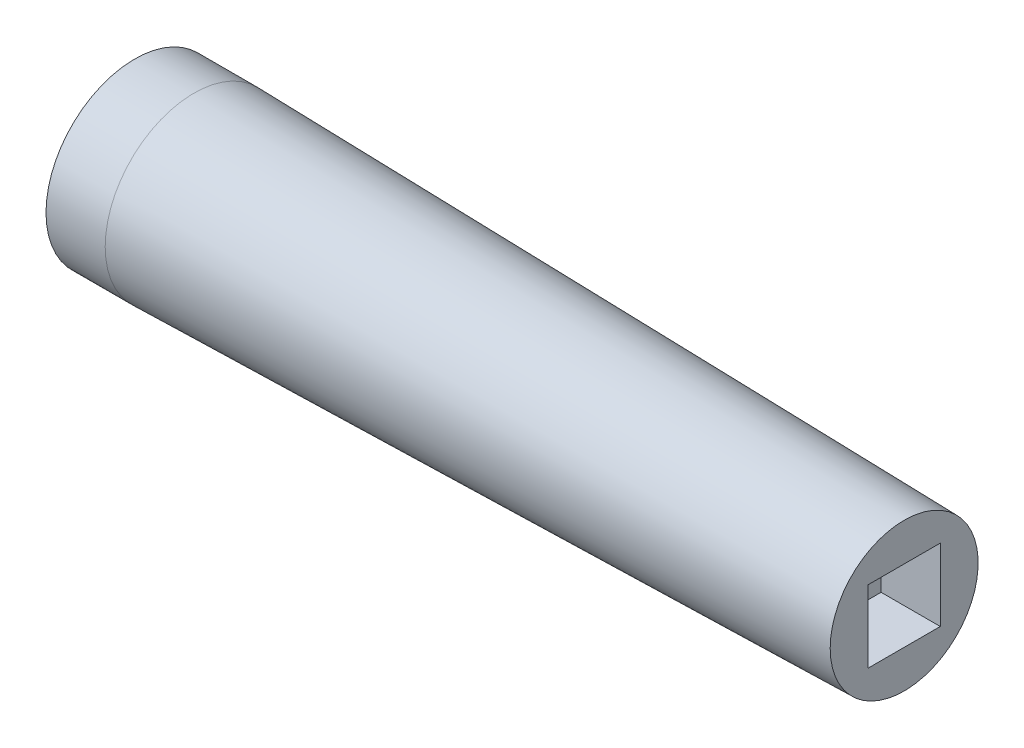
ISO-10303-21;
HEADER;
FILE_DESCRIPTION(('STEP AP214'),'2;1');
FILE_NAME('part.step','',(''),(''),'','','');
FILE_SCHEMA(('AUTOMOTIVE_DESIGN { 1 0 10303 214 1 1 1 1 }'));
ENDSEC;
DATA;
#1=APPLICATION_CONTEXT('core data for automotive mechanical design processes');
#2=APPLICATION_PROTOCOL_DEFINITION('international standard','automotive_design',2000,#1);
#3=PRODUCT_CONTEXT('',#1,'mechanical');
#4=PRODUCT('Part','Part','',(#3));
#5=PRODUCT_RELATED_PRODUCT_CATEGORY('part','',(#4));
#6=PRODUCT_DEFINITION_FORMATION('','',#4);
#7=PRODUCT_DEFINITION_CONTEXT('part definition',#1,'design');
#8=PRODUCT_DEFINITION('design','',#6,#7);
#9=PRODUCT_DEFINITION_SHAPE('','',#8);
#10=(LENGTH_UNIT() NAMED_UNIT(*) SI_UNIT(.MILLI.,.METRE.));
#11=(NAMED_UNIT(*) PLANE_ANGLE_UNIT() SI_UNIT($,.RADIAN.));
#12=(NAMED_UNIT(*) SI_UNIT($,.STERADIAN.) SOLID_ANGLE_UNIT());
#13=UNCERTAINTY_MEASURE_WITH_UNIT(LENGTH_MEASURE(1.E-05),#10,'distance_accuracy_value','');
#14=(GEOMETRIC_REPRESENTATION_CONTEXT(3) GLOBAL_UNCERTAINTY_ASSIGNED_CONTEXT((#13)) GLOBAL_UNIT_ASSIGNED_CONTEXT((#10,
#11,#12)) REPRESENTATION_CONTEXT('',''));
#15=CARTESIAN_POINT('',(0.,0.,0.));
#16=DIRECTION('',(0.,0.,1.));
#17=DIRECTION('',(1.,0.,0.));
#18=AXIS2_PLACEMENT_3D('',#15,#16,#17);
#19=CARTESIAN_POINT('',(0.,19.05,0.));
#20=DIRECTION('',(1.,0.,0.));
#21=DIRECTION('',(0.,0.,-1.));
#22=AXIS2_PLACEMENT_3D('',#19,#20,#21);
#23=PLANE('',#22);
#24=CARTESIAN_POINT('',(0.,0.,0.));
#25=DIRECTION('',(-1.,0.,0.));
#26=DIRECTION('',(0.,0.,1.));
#27=AXIS2_PLACEMENT_3D('',#24,#25,#26);
#28=CIRCLE('',#27,19.05);
#29=CARTESIAN_POINT('',(0.,0.,19.05));
#30=VERTEX_POINT('',#29);
#31=EDGE_CURVE('E108',#30,#30,#28,.T.);
#32=ORIENTED_EDGE('',*,*,#31,.T.);
#33=EDGE_LOOP('',(#32));
#34=FACE_BOUND('',#33,.T.);
#35=ADVANCED_FACE('F33',(#34),#23,.F.);
#36=CARTESIAN_POINT('',(165.1,0.,0.));
#37=DIRECTION('',(-1.,0.,0.));
#38=DIRECTION('',(0.,0.,1.));
#39=AXIS2_PLACEMENT_3D('',#36,#37,#38);
#40=PLANE('',#39);
#41=DIRECTION('',(0.,0.,1.));
#42=VECTOR('',#41,1.);
#43=CARTESIAN_POINT('',(165.1,7.747,7.747));
#44=LINE('',#43,#42);
#45=CARTESIAN_POINT('',(165.1,7.747,-7.747));
#46=VERTEX_POINT('',#45);
#47=CARTESIAN_POINT('',(165.1,7.747,7.747));
#48=VERTEX_POINT('',#47);
#49=EDGE_CURVE('E82',#46,#48,#44,.T.);
#50=ORIENTED_EDGE('',*,*,#49,.F.);
#51=DIRECTION('',(0.,1.,0.));
#52=VECTOR('',#51,1.);
#53=CARTESIAN_POINT('',(165.1,7.747,-7.747));
#54=LINE('',#53,#52);
#55=CARTESIAN_POINT('',(165.1,-7.747,-7.747));
#56=VERTEX_POINT('',#55);
#57=EDGE_CURVE('E47',#56,#46,#54,.T.);
#58=ORIENTED_EDGE('',*,*,#57,.F.);
#59=DIRECTION('',(0.,0.,-1.));
#60=VECTOR('',#59,1.);
#61=CARTESIAN_POINT('',(165.1,-7.747,7.747));
#62=LINE('',#61,#60);
#63=CARTESIAN_POINT('',(165.1,-7.747,7.747));
#64=VERTEX_POINT('',#63);
#65=EDGE_CURVE('E98',#64,#56,#62,.T.);
#66=ORIENTED_EDGE('',*,*,#65,.F.);
#67=DIRECTION('',(0.,-1.,0.));
#68=VECTOR('',#67,1.);
#69=CARTESIAN_POINT('',(165.1,7.747,7.747));
#70=LINE('',#69,#68);
#71=EDGE_CURVE('E104',#48,#64,#70,.T.);
#72=ORIENTED_EDGE('',*,*,#71,.F.);
#73=EDGE_LOOP('',(#50,#58,#66,#72));
#74=FACE_BOUND('',#73,.T.);
#75=CARTESIAN_POINT('',(165.1,0.,0.));
#76=DIRECTION('',(-1.,0.,0.));
#77=DIRECTION('',(0.,0.,1.));
#78=AXIS2_PLACEMENT_3D('',#75,#76,#77);
#79=CIRCLE('',#78,15.875);
#80=CARTESIAN_POINT('',(165.1,0.,15.875));
#81=VERTEX_POINT('',#80);
#82=EDGE_CURVE('E11',#81,#81,#79,.T.);
#83=ORIENTED_EDGE('',*,*,#82,.F.);
#84=EDGE_LOOP('',(#83));
#85=FACE_BOUND('',#84,.T.);
#86=ADVANCED_FACE('F120',(#74,#85),#40,.F.);
#87=CARTESIAN_POINT('',(165.1,0.,0.));
#88=DIRECTION('',(-1.,0.,0.));
#89=DIRECTION('',(0.,0.,1.));
#90=AXIS2_PLACEMENT_3D('',#87,#88,#89);
#91=CONICAL_SURFACE('',#90,15.875,0.0208303200362171);
#92=CARTESIAN_POINT('',(12.7,0.,0.));
#93=DIRECTION('',(-1.,0.,0.));
#94=DIRECTION('',(0.,0.,1.));
#95=AXIS2_PLACEMENT_3D('',#92,#93,#94);
#96=CIRCLE('',#95,19.05);
#97=CARTESIAN_POINT('',(12.7,0.,19.05));
#98=VERTEX_POINT('',#97);
#99=EDGE_CURVE('E40',#98,#98,#96,.T.);
#100=ORIENTED_EDGE('',*,*,#99,.F.);
#101=EDGE_LOOP('',(#100));
#102=FACE_BOUND('',#101,.T.);
#103=ORIENTED_EDGE('',*,*,#82,.T.);
#104=EDGE_LOOP('',(#103));
#105=FACE_BOUND('',#104,.T.);
#106=ADVANCED_FACE('F117',(#102,#105),#91,.T.);
#107=CARTESIAN_POINT('',(0.,0.,0.));
#108=DIRECTION('',(-1.,0.,0.));
#109=DIRECTION('',(0.,0.,1.));
#110=AXIS2_PLACEMENT_3D('',#107,#108,#109);
#111=CYLINDRICAL_SURFACE('',#110,19.05);
#112=ORIENTED_EDGE('',*,*,#31,.F.);
#113=EDGE_LOOP('',(#112));
#114=FACE_BOUND('',#113,.T.);
#115=ORIENTED_EDGE('',*,*,#99,.T.);
#116=EDGE_LOOP('',(#115));
#117=FACE_BOUND('',#116,.T.);
#118=ADVANCED_FACE('F115',(#114,#117),#111,.T.);
#119=CARTESIAN_POINT('',(152.4,7.747,-7.747));
#120=DIRECTION('',(0.,0.,-1.));
#121=DIRECTION('',(0.,1.,0.));
#122=AXIS2_PLACEMENT_3D('',#119,#120,#121);
#123=PLANE('',#122);
#124=ORIENTED_EDGE('',*,*,#57,.T.);
#125=DIRECTION('',(1.,0.,0.));
#126=VECTOR('',#125,1.);
#127=CARTESIAN_POINT('',(152.4,7.747,-7.747));
#128=LINE('',#127,#126);
#129=CARTESIAN_POINT('',(152.4,7.747,-7.747));
#130=VERTEX_POINT('',#129);
#131=EDGE_CURVE('E70',#130,#46,#128,.T.);
#132=ORIENTED_EDGE('',*,*,#131,.F.);
#133=DIRECTION('',(0.,1.,0.));
#134=VECTOR('',#133,1.);
#135=CARTESIAN_POINT('',(152.4,7.747,-7.747));
#136=LINE('',#135,#134);
#137=CARTESIAN_POINT('',(152.4,-7.747,-7.747));
#138=VERTEX_POINT('',#137);
#139=EDGE_CURVE('E96',#138,#130,#136,.T.);
#140=ORIENTED_EDGE('',*,*,#139,.F.);
#141=DIRECTION('',(1.,0.,0.));
#142=VECTOR('',#141,1.);
#143=CARTESIAN_POINT('',(152.4,-7.747,-7.747));
#144=LINE('',#143,#142);
#145=EDGE_CURVE('E55',#138,#56,#144,.T.);
#146=ORIENTED_EDGE('',*,*,#145,.T.);
#147=EDGE_LOOP('',(#124,#132,#140,#146));
#148=FACE_BOUND('',#147,.T.);
#149=ADVANCED_FACE('F133',(#148),#123,.F.);
#150=CARTESIAN_POINT('',(152.4,-7.747,7.747));
#151=DIRECTION('',(0.,-1.,0.));
#152=DIRECTION('',(0.,0.,-1.));
#153=AXIS2_PLACEMENT_3D('',#150,#151,#152);
#154=PLANE('',#153);
#155=ORIENTED_EDGE('',*,*,#65,.T.);
#156=ORIENTED_EDGE('',*,*,#145,.F.);
#157=DIRECTION('',(0.,0.,-1.));
#158=VECTOR('',#157,1.);
#159=CARTESIAN_POINT('',(152.4,-7.747,7.747));
#160=LINE('',#159,#158);
#161=CARTESIAN_POINT('',(152.4,-7.747,7.747));
#162=VERTEX_POINT('',#161);
#163=EDGE_CURVE('E93',#162,#138,#160,.T.);
#164=ORIENTED_EDGE('',*,*,#163,.F.);
#165=DIRECTION('',(1.,0.,0.));
#166=VECTOR('',#165,1.);
#167=CARTESIAN_POINT('',(152.4,-7.747,7.747));
#168=LINE('',#167,#166);
#169=EDGE_CURVE('E86',#162,#64,#168,.T.);
#170=ORIENTED_EDGE('',*,*,#169,.T.);
#171=EDGE_LOOP('',(#155,#156,#164,#170));
#172=FACE_BOUND('',#171,.T.);
#173=ADVANCED_FACE('F137',(#172),#154,.F.);
#174=CARTESIAN_POINT('',(152.4,7.747,7.747));
#175=DIRECTION('',(0.,0.,1.));
#176=DIRECTION('',(0.,-1.,0.));
#177=AXIS2_PLACEMENT_3D('',#174,#175,#176);
#178=PLANE('',#177);
#179=ORIENTED_EDGE('',*,*,#71,.T.);
#180=ORIENTED_EDGE('',*,*,#169,.F.);
#181=DIRECTION('',(0.,-1.,0.));
#182=VECTOR('',#181,1.);
#183=CARTESIAN_POINT('',(152.4,7.747,7.747));
#184=LINE('',#183,#182);
#185=CARTESIAN_POINT('',(152.4,7.747,7.747));
#186=VERTEX_POINT('',#185);
#187=EDGE_CURVE('E89',#186,#162,#184,.T.);
#188=ORIENTED_EDGE('',*,*,#187,.F.);
#189=DIRECTION('',(1.,0.,0.));
#190=VECTOR('',#189,1.);
#191=CARTESIAN_POINT('',(152.4,7.747,7.747));
#192=LINE('',#191,#190);
#193=EDGE_CURVE('E75',#186,#48,#192,.T.);
#194=ORIENTED_EDGE('',*,*,#193,.T.);
#195=EDGE_LOOP('',(#179,#180,#188,#194));
#196=FACE_BOUND('',#195,.T.);
#197=ADVANCED_FACE('F90',(#196),#178,.F.);
#198=CARTESIAN_POINT('',(152.4,7.747,7.747));
#199=DIRECTION('',(0.,1.,0.));
#200=DIRECTION('',(0.,0.,1.));
#201=AXIS2_PLACEMENT_3D('',#198,#199,#200);
#202=PLANE('',#201);
#203=ORIENTED_EDGE('',*,*,#49,.T.);
#204=ORIENTED_EDGE('',*,*,#193,.F.);
#205=DIRECTION('',(0.,0.,1.));
#206=VECTOR('',#205,1.);
#207=CARTESIAN_POINT('',(152.4,7.747,7.747));
#208=LINE('',#207,#206);
#209=EDGE_CURVE('E79',#130,#186,#208,.T.);
#210=ORIENTED_EDGE('',*,*,#209,.F.);
#211=ORIENTED_EDGE('',*,*,#131,.T.);
#212=EDGE_LOOP('',(#203,#204,#210,#211));
#213=FACE_BOUND('',#212,.T.);
#214=ADVANCED_FACE('F77',(#213),#202,.F.);
#215=CARTESIAN_POINT('',(152.4,0.,0.));
#216=DIRECTION('',(1.,0.,0.));
#217=DIRECTION('',(0.,0.,-1.));
#218=AXIS2_PLACEMENT_3D('',#215,#216,#217);
#219=PLANE('',#218);
#220=ORIENTED_EDGE('',*,*,#139,.T.);
#221=ORIENTED_EDGE('',*,*,#209,.T.);
#222=ORIENTED_EDGE('',*,*,#187,.T.);
#223=ORIENTED_EDGE('',*,*,#163,.T.);
#224=EDGE_LOOP('',(#220,#221,#222,#223));
#225=FACE_BOUND('',#224,.T.);
#226=ADVANCED_FACE('F95',(#225),#219,.T.);
#227=CLOSED_SHELL('',(#35,#86,#106,#118,#149,#173,#197,#214,#226));
#228=MANIFOLD_SOLID_BREP('B2',#227);
#229=ADVANCED_BREP_SHAPE_REPRESENTATION('',(#18,#228),#14);
#230=SHAPE_DEFINITION_REPRESENTATION(#9,#229);
ENDSEC;
END-ISO-10303-21;
